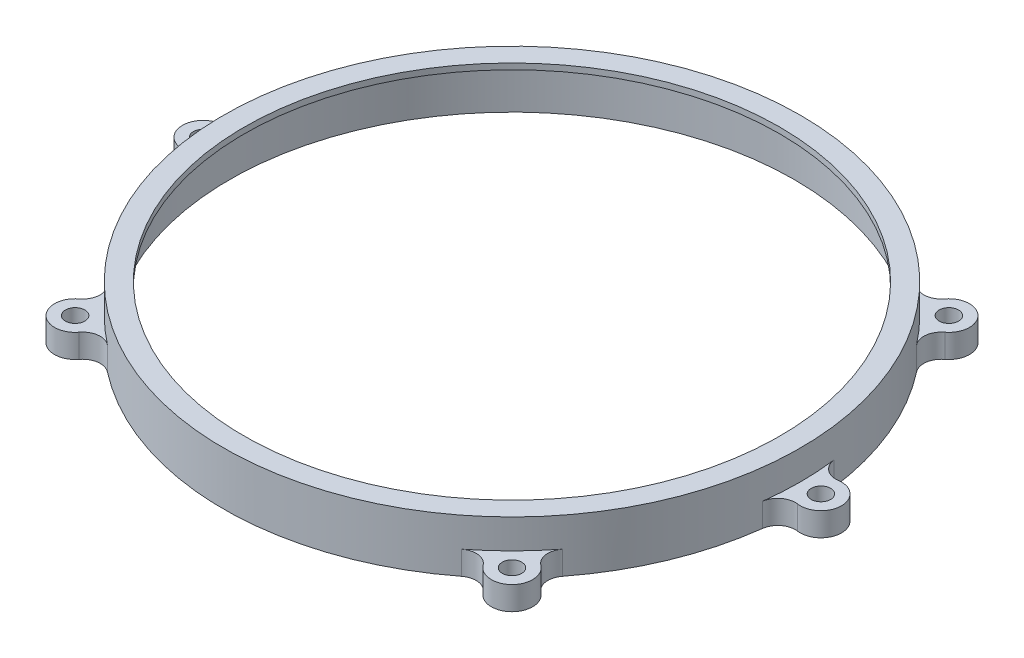
ISO-10303-21;
HEADER;
FILE_DESCRIPTION(('STEP AP214'),'2;1');
FILE_NAME('part.step','',(''),(''),'','','');
FILE_SCHEMA(('AUTOMOTIVE_DESIGN { 1 0 10303 214 1 1 1 1 }'));
ENDSEC;
DATA;
#1=APPLICATION_CONTEXT('core data for automotive mechanical design processes');
#2=APPLICATION_PROTOCOL_DEFINITION('international standard','automotive_design',2000,#1);
#3=PRODUCT_CONTEXT('',#1,'mechanical');
#4=PRODUCT('Part','Part','',(#3));
#5=PRODUCT_RELATED_PRODUCT_CATEGORY('part','',(#4));
#6=PRODUCT_DEFINITION_FORMATION('','',#4);
#7=PRODUCT_DEFINITION_CONTEXT('part definition',#1,'design');
#8=PRODUCT_DEFINITION('design','',#6,#7);
#9=PRODUCT_DEFINITION_SHAPE('','',#8);
#10=(LENGTH_UNIT() NAMED_UNIT(*) SI_UNIT(.MILLI.,.METRE.));
#11=(NAMED_UNIT(*) PLANE_ANGLE_UNIT() SI_UNIT($,.RADIAN.));
#12=(NAMED_UNIT(*) SI_UNIT($,.STERADIAN.) SOLID_ANGLE_UNIT());
#13=UNCERTAINTY_MEASURE_WITH_UNIT(LENGTH_MEASURE(1.E-05),#10,'distance_accuracy_value','');
#14=(GEOMETRIC_REPRESENTATION_CONTEXT(3) GLOBAL_UNCERTAINTY_ASSIGNED_CONTEXT((#13)) GLOBAL_UNIT_ASSIGNED_CONTEXT((#10,
#11,#12)) REPRESENTATION_CONTEXT('',''));
#15=CARTESIAN_POINT('',(0.,0.,0.));
#16=DIRECTION('',(0.,0.,1.));
#17=DIRECTION('',(1.,0.,0.));
#18=AXIS2_PLACEMENT_3D('',#15,#16,#17);
#19=CARTESIAN_POINT('',(56.,4.,0.));
#20=DIRECTION('',(0.,1.,0.));
#21=DIRECTION('',(0.,0.,1.));
#22=AXIS2_PLACEMENT_3D('',#19,#20,#21);
#23=PLANE('',#22);
#24=CARTESIAN_POINT('',(-31.9347872385294,4.,-41.0386325799223));
#25=DIRECTION('',(0.,1.,0.));
#26=DIRECTION('',(0.,0.,1.));
#27=AXIS2_PLACEMENT_3D('',#24,#25,#26);
#28=CIRCLE('',#27,3.);
#29=CARTESIAN_POINT('',(-34.3293959033437,4.,-39.231466471786));
#30=VERTEX_POINT('',#29);
#31=CARTESIAN_POINT('',(-30.0923956670758,4.,-38.6710191618498));
#32=VERTEX_POINT('',#31);
#33=EDGE_CURVE('E367',#30,#32,#28,.T.);
#34=ORIENTED_EDGE('',*,*,#33,.F.);
#35=CARTESIAN_POINT('',(-37.1231060122937,4.,-37.1231060122937));
#36=DIRECTION('',(0.,1.,0.));
#37=DIRECTION('',(0.,0.,1.));
#38=AXIS2_PLACEMENT_3D('',#35,#36,#37);
#39=CIRCLE('',#38,3.5);
#40=CARTESIAN_POINT('',(-39.231466471786,4.,-34.3293959033437));
#41=VERTEX_POINT('',#40);
#42=EDGE_CURVE('E217',#41,#30,#39,.F.);
#43=ORIENTED_EDGE('',*,*,#42,.F.);
#44=CARTESIAN_POINT('',(-41.0386325799223,4.,-31.9347872385294));
#45=DIRECTION('',(0.,1.,0.));
#46=DIRECTION('',(0.,0.,1.));
#47=AXIS2_PLACEMENT_3D('',#44,#45,#46);
#48=CIRCLE('',#47,3.00000000000001);
#49=CARTESIAN_POINT('',(-38.6710191618498,4.,-30.0923956670758));
#50=VERTEX_POINT('',#49);
#51=EDGE_CURVE('E364',#50,#41,#48,.T.);
#52=ORIENTED_EDGE('',*,*,#51,.F.);
#53=CARTESIAN_POINT('',(0.,4.,0.));
#54=DIRECTION('',(0.,-1.,0.));
#55=DIRECTION('',(0.,0.,-1.));
#56=AXIS2_PLACEMENT_3D('',#53,#54,#55);
#57=CIRCLE('',#56,49.);
#58=EDGE_CURVE('E408',#50,#32,#57,.T.);
#59=ORIENTED_EDGE('',*,*,#58,.T.);
#60=EDGE_LOOP('',(#34,#43,#52,#59));
#61=FACE_BOUND('',#60,.T.);
#62=CARTESIAN_POINT('',(-37.1231060122937,4.,-37.1231060122937));
#63=DIRECTION('',(0.,1.,0.));
#64=DIRECTION('',(0.,0.,1.));
#65=AXIS2_PLACEMENT_3D('',#62,#63,#64);
#66=CIRCLE('',#65,1.65);
#67=CARTESIAN_POINT('',(-37.1231060122937,4.,-35.4731060122938));
#68=VERTEX_POINT('',#67);
#69=EDGE_CURVE('E372',#68,#68,#66,.T.);
#70=ORIENTED_EDGE('',*,*,#69,.F.);
#71=EDGE_LOOP('',(#70));
#72=FACE_BOUND('',#71,.T.);
#73=ADVANCED_FACE('F37',(#61,#72),#23,.T.);
#74=CARTESIAN_POINT('',(-51.5999999999999,4.,-6.43739077577305));
#75=DIRECTION('',(0.,1.,0.));
#76=DIRECTION('',(0.,0.,1.));
#77=AXIS2_PLACEMENT_3D('',#74,#75,#76);
#78=CIRCLE('',#77,3.);
#79=CARTESIAN_POINT('',(-52.0153846153846,4.,-3.46628734080116));
#80=VERTEX_POINT('',#79);
#81=CARTESIAN_POINT('',(-48.6230769230769,4.,-6.06600284640157));
#82=VERTEX_POINT('',#81);
#83=EDGE_CURVE('E362',#80,#82,#78,.T.);
#84=ORIENTED_EDGE('',*,*,#83,.F.);
#85=CARTESIAN_POINT('',(-52.5,4.,-6.34908792207511E-13));
#86=DIRECTION('',(0.,1.,0.));
#87=DIRECTION('',(0.,0.,1.));
#88=AXIS2_PLACEMENT_3D('',#85,#86,#87);
#89=CIRCLE('',#88,3.5);
#90=CARTESIAN_POINT('',(-52.0153846153847,4.,3.46628734079991));
#91=VERTEX_POINT('',#90);
#92=EDGE_CURVE('E360',#91,#80,#89,.F.);
#93=ORIENTED_EDGE('',*,*,#92,.F.);
#94=CARTESIAN_POINT('',(-51.6000000000001,4.,6.43739077577181));
#95=DIRECTION('',(0.,1.,0.));
#96=DIRECTION('',(0.,0.,1.));
#97=AXIS2_PLACEMENT_3D('',#94,#95,#96);
#98=CIRCLE('',#97,3.00000000000001);
#99=CARTESIAN_POINT('',(-48.623076923077,4.,6.06600284640036));
#100=VERTEX_POINT('',#99);
#101=EDGE_CURVE('E358',#100,#91,#98,.T.);
#102=ORIENTED_EDGE('',*,*,#101,.F.);
#103=EDGE_CURVE('E633',#100,#82,#57,.T.);
#104=ORIENTED_EDGE('',*,*,#103,.T.);
#105=EDGE_LOOP('',(#84,#93,#102,#104));
#106=FACE_BOUND('',#105,.T.);
#107=CARTESIAN_POINT('',(-52.5,4.,9.17114576262564E-13));
#108=DIRECTION('',(0.,1.,0.));
#109=DIRECTION('',(0.,0.,1.));
#110=AXIS2_PLACEMENT_3D('',#107,#108,#109);
#111=CIRCLE('',#110,1.65);
#112=CARTESIAN_POINT('',(-52.5,4.,1.65000000000091));
#113=VERTEX_POINT('',#112);
#114=EDGE_CURVE('E378',#113,#113,#111,.T.);
#115=ORIENTED_EDGE('',*,*,#114,.F.);
#116=EDGE_LOOP('',(#115));
#117=FACE_BOUND('',#116,.T.);
#118=ADVANCED_FACE('F433',(#106,#117),#23,.T.);
#119=CARTESIAN_POINT('',(-41.0386325799226,4.,31.934787238529));
#120=DIRECTION('',(0.,1.,0.));
#121=DIRECTION('',(0.,0.,1.));
#122=AXIS2_PLACEMENT_3D('',#119,#120,#121);
#123=CIRCLE('',#122,3.);
#124=CARTESIAN_POINT('',(-39.2314664717864,4.,34.3293959033433));
#125=VERTEX_POINT('',#124);
#126=CARTESIAN_POINT('',(-38.6710191618501,4.,30.0923956670754));
#127=VERTEX_POINT('',#126);
#128=EDGE_CURVE('E356',#125,#127,#123,.T.);
#129=ORIENTED_EDGE('',*,*,#128,.F.);
#130=CARTESIAN_POINT('',(-37.1231060122941,4.,37.1231060122934));
#131=DIRECTION('',(0.,1.,0.));
#132=DIRECTION('',(0.,0.,1.));
#133=AXIS2_PLACEMENT_3D('',#130,#131,#132);
#134=CIRCLE('',#133,3.5);
#135=CARTESIAN_POINT('',(-34.3293959033441,4.,39.2314664717857));
#136=VERTEX_POINT('',#135);
#137=EDGE_CURVE('E354',#136,#125,#134,.F.);
#138=ORIENTED_EDGE('',*,*,#137,.F.);
#139=CARTESIAN_POINT('',(-31.9347872385299,4.,41.038632579922));
#140=DIRECTION('',(0.,1.,0.));
#141=DIRECTION('',(0.,0.,1.));
#142=AXIS2_PLACEMENT_3D('',#139,#140,#141);
#143=CIRCLE('',#142,3.);
#144=CARTESIAN_POINT('',(-30.0923956670762,4.,38.6710191618495));
#145=VERTEX_POINT('',#144);
#146=EDGE_CURVE('E352',#145,#136,#143,.T.);
#147=ORIENTED_EDGE('',*,*,#146,.F.);
#148=EDGE_CURVE('E612',#145,#127,#57,.T.);
#149=ORIENTED_EDGE('',*,*,#148,.T.);
#150=EDGE_LOOP('',(#129,#138,#147,#149));
#151=FACE_BOUND('',#150,.T.);
#152=CARTESIAN_POINT('',(-37.1231060122936,4.,37.123106012294));
#153=DIRECTION('',(0.,1.,0.));
#154=DIRECTION('',(0.,0.,1.));
#155=AXIS2_PLACEMENT_3D('',#152,#153,#154);
#156=CIRCLE('',#155,1.65);
#157=CARTESIAN_POINT('',(-37.1231060122936,4.,38.7731060122939));
#158=VERTEX_POINT('',#157);
#159=EDGE_CURVE('E384',#158,#158,#156,.T.);
#160=ORIENTED_EDGE('',*,*,#159,.F.);
#161=EDGE_LOOP('',(#160));
#162=FACE_BOUND('',#161,.T.);
#163=ADVANCED_FACE('F440',(#151,#162),#23,.T.);
#164=CARTESIAN_POINT('',(31.9347872385292,4.,41.0386325799225));
#165=DIRECTION('',(0.,1.,0.));
#166=DIRECTION('',(0.,0.,1.));
#167=AXIS2_PLACEMENT_3D('',#164,#165,#166);
#168=CIRCLE('',#167,3.);
#169=CARTESIAN_POINT('',(34.3293959033435,4.,39.2314664717863));
#170=VERTEX_POINT('',#169);
#171=CARTESIAN_POINT('',(30.0923956670756,4.,38.67101916185));
#172=VERTEX_POINT('',#171);
#173=EDGE_CURVE('E350',#170,#172,#168,.T.);
#174=ORIENTED_EDGE('',*,*,#173,.F.);
#175=CARTESIAN_POINT('',(37.1231060122935,4.,37.123106012294));
#176=DIRECTION('',(0.,1.,0.));
#177=DIRECTION('',(0.,0.,1.));
#178=AXIS2_PLACEMENT_3D('',#175,#176,#177);
#179=CIRCLE('',#178,3.5);
#180=CARTESIAN_POINT('',(39.2314664717858,4.,34.329395903344));
#181=VERTEX_POINT('',#180);
#182=EDGE_CURVE('E348',#181,#170,#179,.F.);
#183=ORIENTED_EDGE('',*,*,#182,.F.);
#184=CARTESIAN_POINT('',(41.0386325799221,4.,31.9347872385297));
#185=DIRECTION('',(0.,1.,0.));
#186=DIRECTION('',(0.,0.,1.));
#187=AXIS2_PLACEMENT_3D('',#184,#185,#186);
#188=CIRCLE('',#187,3.);
#189=CARTESIAN_POINT('',(38.6710191618496,4.,30.0923956670761));
#190=VERTEX_POINT('',#189);
#191=EDGE_CURVE('E346',#190,#181,#188,.T.);
#192=ORIENTED_EDGE('',*,*,#191,.F.);
#193=EDGE_CURVE('E600',#190,#172,#57,.T.);
#194=ORIENTED_EDGE('',*,*,#193,.T.);
#195=EDGE_LOOP('',(#174,#183,#192,#194));
#196=FACE_BOUND('',#195,.T.);
#197=CARTESIAN_POINT('',(37.1231060122941,4.,37.1231060122934));
#198=DIRECTION('',(0.,1.,0.));
#199=DIRECTION('',(0.,0.,1.));
#200=AXIS2_PLACEMENT_3D('',#197,#198,#199);
#201=CIRCLE('',#200,1.65);
#202=CARTESIAN_POINT('',(37.1231060122941,4.,38.7731060122934));
#203=VERTEX_POINT('',#202);
#204=EDGE_CURVE('E390',#203,#203,#201,.T.);
#205=ORIENTED_EDGE('',*,*,#204,.F.);
#206=EDGE_LOOP('',(#205));
#207=FACE_BOUND('',#206,.T.);
#208=ADVANCED_FACE('F459',(#196,#207),#23,.T.);
#209=CARTESIAN_POINT('',(51.6,4.,6.43739077577269));
#210=DIRECTION('',(0.,1.,0.));
#211=DIRECTION('',(0.,0.,1.));
#212=AXIS2_PLACEMENT_3D('',#209,#210,#211);
#213=CIRCLE('',#212,3.);
#214=CARTESIAN_POINT('',(52.0153846153846,4.,3.4662873408008));
#215=VERTEX_POINT('',#214);
#216=CARTESIAN_POINT('',(48.6230769230769,4.,6.06600284640121));
#217=VERTEX_POINT('',#216);
#218=EDGE_CURVE('E344',#215,#217,#213,.T.);
#219=ORIENTED_EDGE('',*,*,#218,.F.);
#220=CARTESIAN_POINT('',(52.5,4.,2.74086309204336E-13));
#221=DIRECTION('',(0.,1.,0.));
#222=DIRECTION('',(0.,0.,1.));
#223=AXIS2_PLACEMENT_3D('',#220,#221,#222);
#224=CIRCLE('',#223,3.5);
#225=CARTESIAN_POINT('',(52.0153846153847,4.,-3.46628734080027));
#226=VERTEX_POINT('',#225);
#227=EDGE_CURVE('E342',#226,#215,#224,.F.);
#228=ORIENTED_EDGE('',*,*,#227,.F.);
#229=CARTESIAN_POINT('',(51.6000000000001,4.,-6.43739077577217));
#230=DIRECTION('',(0.,1.,0.));
#231=DIRECTION('',(0.,0.,1.));
#232=AXIS2_PLACEMENT_3D('',#229,#230,#231);
#233=CIRCLE('',#232,3.00000000000001);
#234=CARTESIAN_POINT('',(48.623076923077,4.,-6.06600284640069));
#235=VERTEX_POINT('',#234);
#236=EDGE_CURVE('E340',#235,#226,#233,.T.);
#237=ORIENTED_EDGE('',*,*,#236,.F.);
#238=EDGE_CURVE('E413',#235,#217,#57,.T.);
#239=ORIENTED_EDGE('',*,*,#238,.T.);
#240=EDGE_LOOP('',(#219,#228,#237,#239));
#241=FACE_BOUND('',#240,.T.);
#242=CARTESIAN_POINT('',(52.5,4.,-5.45281089620994E-13));
#243=DIRECTION('',(0.,1.,0.));
#244=DIRECTION('',(0.,0.,1.));
#245=AXIS2_PLACEMENT_3D('',#242,#243,#244);
#246=CIRCLE('',#245,1.65);
#247=CARTESIAN_POINT('',(52.5,4.,1.64999999999945));
#248=VERTEX_POINT('',#247);
#249=EDGE_CURVE('E396',#248,#248,#246,.T.);
#250=ORIENTED_EDGE('',*,*,#249,.F.);
#251=EDGE_LOOP('',(#250));
#252=FACE_BOUND('',#251,.T.);
#253=ADVANCED_FACE('F448',(#241,#252),#23,.T.);
#254=CARTESIAN_POINT('',(48.,0.,0.));
#255=DIRECTION('',(0.,-1.,0.));
#256=DIRECTION('',(0.,0.,-1.));
#257=AXIS2_PLACEMENT_3D('',#254,#255,#256);
#258=PLANE('',#257);
#259=CARTESIAN_POINT('',(-37.1231060122937,0.,-37.1231060122937));
#260=DIRECTION('',(0.,-1.,0.));
#261=DIRECTION('',(0.,0.,-1.));
#262=AXIS2_PLACEMENT_3D('',#259,#260,#261);
#263=CIRCLE('',#262,1.64999999999999);
#264=CARTESIAN_POINT('',(-37.1231060122937,0.,-38.7731060122937));
#265=VERTEX_POINT('',#264);
#266=EDGE_CURVE('E369',#265,#265,#263,.T.);
#267=ORIENTED_EDGE('',*,*,#266,.F.);
#268=EDGE_LOOP('',(#267));
#269=FACE_BOUND('',#268,.T.);
#270=CARTESIAN_POINT('',(-52.5,0.,9.17114576262564E-13));
#271=DIRECTION('',(0.,-1.,0.));
#272=DIRECTION('',(0.,0.,-1.));
#273=AXIS2_PLACEMENT_3D('',#270,#271,#272);
#274=CIRCLE('',#273,1.64999999999999);
#275=CARTESIAN_POINT('',(-52.5,0.,-1.64999999999907));
#276=VERTEX_POINT('',#275);
#277=EDGE_CURVE('E375',#276,#276,#274,.T.);
#278=ORIENTED_EDGE('',*,*,#277,.F.);
#279=EDGE_LOOP('',(#278));
#280=FACE_BOUND('',#279,.T.);
#281=CARTESIAN_POINT('',(-37.1231060122936,0.,37.123106012294));
#282=DIRECTION('',(0.,-1.,0.));
#283=DIRECTION('',(0.,0.,-1.));
#284=AXIS2_PLACEMENT_3D('',#281,#282,#283);
#285=CIRCLE('',#284,1.64999999999999);
#286=CARTESIAN_POINT('',(-37.1231060122936,0.,35.473106012294));
#287=VERTEX_POINT('',#286);
#288=EDGE_CURVE('E381',#287,#287,#285,.T.);
#289=ORIENTED_EDGE('',*,*,#288,.F.);
#290=EDGE_LOOP('',(#289));
#291=FACE_BOUND('',#290,.T.);
#292=CARTESIAN_POINT('',(37.1231060122941,0.,37.1231060122934));
#293=DIRECTION('',(0.,-1.,0.));
#294=DIRECTION('',(0.,0.,-1.));
#295=AXIS2_PLACEMENT_3D('',#292,#293,#294);
#296=CIRCLE('',#295,1.64999999999999);
#297=CARTESIAN_POINT('',(37.1231060122941,0.,35.4731060122934));
#298=VERTEX_POINT('',#297);
#299=EDGE_CURVE('E387',#298,#298,#296,.T.);
#300=ORIENTED_EDGE('',*,*,#299,.F.);
#301=EDGE_LOOP('',(#300));
#302=FACE_BOUND('',#301,.T.);
#303=CARTESIAN_POINT('',(52.5,0.,-5.45281089620994E-13));
#304=DIRECTION('',(0.,-1.,0.));
#305=DIRECTION('',(0.,0.,-1.));
#306=AXIS2_PLACEMENT_3D('',#303,#304,#305);
#307=CIRCLE('',#306,1.64999999999999);
#308=CARTESIAN_POINT('',(52.5,0.,-1.65000000000054));
#309=VERTEX_POINT('',#308);
#310=EDGE_CURVE('E393',#309,#309,#307,.T.);
#311=ORIENTED_EDGE('',*,*,#310,.F.);
#312=EDGE_LOOP('',(#311));
#313=FACE_BOUND('',#312,.T.);
#314=CARTESIAN_POINT('',(37.1231060122937,0.,-37.1231060122937));
#315=DIRECTION('',(0.,-1.,0.));
#316=DIRECTION('',(0.,0.,-1.));
#317=AXIS2_PLACEMENT_3D('',#314,#315,#316);
#318=CIRCLE('',#317,1.64999999999999);
#319=CARTESIAN_POINT('',(37.1231060122937,0.,-38.7731060122937));
#320=VERTEX_POINT('',#319);
#321=EDGE_CURVE('E399',#320,#320,#318,.T.);
#322=ORIENTED_EDGE('',*,*,#321,.F.);
#323=EDGE_LOOP('',(#322));
#324=FACE_BOUND('',#323,.T.);
#325=CARTESIAN_POINT('',(0.,0.,0.));
#326=DIRECTION('',(0.,-1.,0.));
#327=DIRECTION('',(0.,0.,-1.));
#328=AXIS2_PLACEMENT_3D('',#325,#326,#327);
#329=CIRCLE('',#328,48.);
#330=CARTESIAN_POINT('',(0.,0.,-48.));
#331=VERTEX_POINT('',#330);
#332=EDGE_CURVE('E405',#331,#331,#329,.T.);
#333=ORIENTED_EDGE('',*,*,#332,.F.);
#334=EDGE_LOOP('',(#333));
#335=FACE_BOUND('',#334,.T.);
#336=CARTESIAN_POINT('',(-31.9347872385294,0.,-41.0386325799223));
#337=DIRECTION('',(0.,-1.,0.));
#338=DIRECTION('',(0.,0.,-1.));
#339=AXIS2_PLACEMENT_3D('',#336,#337,#338);
#340=CIRCLE('',#339,3.);
#341=CARTESIAN_POINT('',(-30.0923956670758,0.,-38.6710191618498));
#342=VERTEX_POINT('',#341);
#343=CARTESIAN_POINT('',(-34.3293959033437,0.,-39.231466471786));
#344=VERTEX_POINT('',#343);
#345=EDGE_CURVE('E206',#342,#344,#340,.T.);
#346=ORIENTED_EDGE('',*,*,#345,.F.);
#347=CARTESIAN_POINT('',(0.,0.,0.));
#348=DIRECTION('',(0.,1.,0.));
#349=DIRECTION('',(0.,0.,-1.));
#350=AXIS2_PLACEMENT_3D('',#347,#348,#349);
#351=CIRCLE('',#350,49.);
#352=CARTESIAN_POINT('',(30.0923956670765,0.,-38.6710191618493));
#353=VERTEX_POINT('',#352);
#354=EDGE_CURVE('E283',#353,#342,#351,.T.);
#355=ORIENTED_EDGE('',*,*,#354,.F.);
#356=CARTESIAN_POINT('',(31.9347872385302,0.,-41.0386325799217));
#357=DIRECTION('',(0.,-1.,0.));
#358=DIRECTION('',(0.,0.,1.));
#359=AXIS2_PLACEMENT_3D('',#356,#357,#358);
#360=CIRCLE('',#359,3.00000000000001);
#361=CARTESIAN_POINT('',(34.3293959033444,0.,-39.2314664717854));
#362=VERTEX_POINT('',#361);
#363=EDGE_CURVE('E61',#362,#353,#360,.T.);
#364=ORIENTED_EDGE('',*,*,#363,.F.);
#365=CARTESIAN_POINT('',(37.1231060122944,0.,-37.1231060122931));
#366=DIRECTION('',(0.,1.,0.));
#367=DIRECTION('',(0.,0.,1.));
#368=AXIS2_PLACEMENT_3D('',#365,#366,#367);
#369=CIRCLE('',#368,3.5);
#370=CARTESIAN_POINT('',(39.2314664717866,0.,-34.3293959033431));
#371=VERTEX_POINT('',#370);
#372=EDGE_CURVE('E279',#371,#362,#369,.T.);
#373=ORIENTED_EDGE('',*,*,#372,.F.);
#374=CARTESIAN_POINT('',(41.0386325799228,0.,-31.9347872385287));
#375=DIRECTION('',(0.,-1.,0.));
#376=DIRECTION('',(0.,0.,-1.));
#377=AXIS2_PLACEMENT_3D('',#374,#375,#376);
#378=CIRCLE('',#377,3.);
#379=CARTESIAN_POINT('',(38.6710191618504,0.,-30.0923956670752));
#380=VERTEX_POINT('',#379);
#381=EDGE_CURVE('E276',#380,#371,#378,.T.);
#382=ORIENTED_EDGE('',*,*,#381,.F.);
#383=CARTESIAN_POINT('',(0.,0.,0.));
#384=DIRECTION('',(0.,1.,0.));
#385=DIRECTION('',(0.,0.,1.));
#386=AXIS2_PLACEMENT_3D('',#383,#384,#385);
#387=CIRCLE('',#386,49.);
#388=CARTESIAN_POINT('',(48.623076923077,0.,-6.06600284640069));
#389=VERTEX_POINT('',#388);
#390=EDGE_CURVE('E273',#389,#380,#387,.T.);
#391=ORIENTED_EDGE('',*,*,#390,.F.);
#392=CARTESIAN_POINT('',(51.6000000000001,0.,-6.43739077577217));
#393=DIRECTION('',(0.,-1.,0.));
#394=DIRECTION('',(0.,0.,1.));
#395=AXIS2_PLACEMENT_3D('',#392,#393,#394);
#396=CIRCLE('',#395,3.00000000000001);
#397=CARTESIAN_POINT('',(52.0153846153847,0.,-3.46628734080027));
#398=VERTEX_POINT('',#397);
#399=EDGE_CURVE('E270',#398,#389,#396,.T.);
#400=ORIENTED_EDGE('',*,*,#399,.F.);
#401=CARTESIAN_POINT('',(52.5,0.,2.74086309204336E-13));
#402=DIRECTION('',(0.,1.,0.));
#403=DIRECTION('',(0.,0.,1.));
#404=AXIS2_PLACEMENT_3D('',#401,#402,#403);
#405=CIRCLE('',#404,3.5);
#406=CARTESIAN_POINT('',(52.0153846153846,0.,3.4662873408008));
#407=VERTEX_POINT('',#406);
#408=EDGE_CURVE('E267',#407,#398,#405,.T.);
#409=ORIENTED_EDGE('',*,*,#408,.F.);
#410=CARTESIAN_POINT('',(51.6,0.,6.43739077577269));
#411=DIRECTION('',(0.,-1.,0.));
#412=DIRECTION('',(0.,0.,-1.));
#413=AXIS2_PLACEMENT_3D('',#410,#411,#412);
#414=CIRCLE('',#413,3.);
#415=CARTESIAN_POINT('',(48.6230769230769,0.,6.06600284640121));
#416=VERTEX_POINT('',#415);
#417=EDGE_CURVE('E264',#416,#407,#414,.T.);
#418=ORIENTED_EDGE('',*,*,#417,.F.);
#419=CARTESIAN_POINT('',(0.,0.,0.));
#420=DIRECTION('',(0.,1.,0.));
#421=DIRECTION('',(0.,0.,1.));
#422=AXIS2_PLACEMENT_3D('',#419,#420,#421);
#423=CIRCLE('',#422,49.);
#424=CARTESIAN_POINT('',(38.6710191618496,0.,30.0923956670761));
#425=VERTEX_POINT('',#424);
#426=EDGE_CURVE('E261',#425,#416,#423,.T.);
#427=ORIENTED_EDGE('',*,*,#426,.F.);
#428=CARTESIAN_POINT('',(41.0386325799221,0.,31.9347872385297));
#429=DIRECTION('',(0.,-1.,0.));
#430=DIRECTION('',(0.,0.,1.));
#431=AXIS2_PLACEMENT_3D('',#428,#429,#430);
#432=CIRCLE('',#431,3.);
#433=CARTESIAN_POINT('',(39.2314664717858,0.,34.329395903344));
#434=VERTEX_POINT('',#433);
#435=EDGE_CURVE('E258',#434,#425,#432,.T.);
#436=ORIENTED_EDGE('',*,*,#435,.F.);
#437=CARTESIAN_POINT('',(37.1231060122935,0.,37.123106012294));
#438=DIRECTION('',(0.,1.,0.));
#439=DIRECTION('',(0.,0.,1.));
#440=AXIS2_PLACEMENT_3D('',#437,#438,#439);
#441=CIRCLE('',#440,3.5);
#442=CARTESIAN_POINT('',(34.3293959033435,0.,39.2314664717863));
#443=VERTEX_POINT('',#442);
#444=EDGE_CURVE('E255',#443,#434,#441,.T.);
#445=ORIENTED_EDGE('',*,*,#444,.F.);
#446=CARTESIAN_POINT('',(31.9347872385292,0.,41.0386325799225));
#447=DIRECTION('',(0.,-1.,0.));
#448=DIRECTION('',(0.,0.,-1.));
#449=AXIS2_PLACEMENT_3D('',#446,#447,#448);
#450=CIRCLE('',#449,3.);
#451=CARTESIAN_POINT('',(30.0923956670756,0.,38.67101916185));
#452=VERTEX_POINT('',#451);
#453=EDGE_CURVE('E252',#452,#443,#450,.T.);
#454=ORIENTED_EDGE('',*,*,#453,.F.);
#455=CARTESIAN_POINT('',(0.,0.,0.));
#456=DIRECTION('',(0.,1.,0.));
#457=DIRECTION('',(0.,0.,1.));
#458=AXIS2_PLACEMENT_3D('',#455,#456,#457);
#459=CIRCLE('',#458,49.);
#460=CARTESIAN_POINT('',(-30.0923956670762,0.,38.6710191618495));
#461=VERTEX_POINT('',#460);
#462=EDGE_CURVE('E249',#461,#452,#459,.T.);
#463=ORIENTED_EDGE('',*,*,#462,.F.);
#464=CARTESIAN_POINT('',(-31.9347872385299,0.,41.038632579922));
#465=DIRECTION('',(0.,-1.,0.));
#466=DIRECTION('',(0.,0.,1.));
#467=AXIS2_PLACEMENT_3D('',#464,#465,#466);
#468=CIRCLE('',#467,3.);
#469=CARTESIAN_POINT('',(-34.3293959033441,0.,39.2314664717857));
#470=VERTEX_POINT('',#469);
#471=EDGE_CURVE('E246',#470,#461,#468,.T.);
#472=ORIENTED_EDGE('',*,*,#471,.F.);
#473=CARTESIAN_POINT('',(-37.1231060122941,0.,37.1231060122934));
#474=DIRECTION('',(0.,1.,0.));
#475=DIRECTION('',(0.,0.,1.));
#476=AXIS2_PLACEMENT_3D('',#473,#474,#475);
#477=CIRCLE('',#476,3.5);
#478=CARTESIAN_POINT('',(-39.2314664717864,0.,34.3293959033433));
#479=VERTEX_POINT('',#478);
#480=EDGE_CURVE('E244',#479,#470,#477,.T.);
#481=ORIENTED_EDGE('',*,*,#480,.F.);
#482=CARTESIAN_POINT('',(-41.0386325799226,0.,31.934787238529));
#483=DIRECTION('',(0.,-1.,0.));
#484=DIRECTION('',(0.,0.,-1.));
#485=AXIS2_PLACEMENT_3D('',#482,#483,#484);
#486=CIRCLE('',#485,3.);
#487=CARTESIAN_POINT('',(-38.6710191618501,0.,30.0923956670754));
#488=VERTEX_POINT('',#487);
#489=EDGE_CURVE('E241',#488,#479,#486,.T.);
#490=ORIENTED_EDGE('',*,*,#489,.F.);
#491=CARTESIAN_POINT('',(0.,0.,0.));
#492=DIRECTION('',(0.,1.,0.));
#493=DIRECTION('',(0.,0.,1.));
#494=AXIS2_PLACEMENT_3D('',#491,#492,#493);
#495=CIRCLE('',#494,49.);
#496=CARTESIAN_POINT('',(-48.623076923077,0.,6.06600284640036));
#497=VERTEX_POINT('',#496);
#498=EDGE_CURVE('E238',#497,#488,#495,.T.);
#499=ORIENTED_EDGE('',*,*,#498,.F.);
#500=CARTESIAN_POINT('',(-51.6000000000001,0.,6.43739077577181));
#501=DIRECTION('',(0.,-1.,0.));
#502=DIRECTION('',(0.,0.,1.));
#503=AXIS2_PLACEMENT_3D('',#500,#501,#502);
#504=CIRCLE('',#503,3.00000000000001);
#505=CARTESIAN_POINT('',(-52.0153846153847,0.,3.46628734079991));
#506=VERTEX_POINT('',#505);
#507=EDGE_CURVE('E235',#506,#497,#504,.T.);
#508=ORIENTED_EDGE('',*,*,#507,.F.);
#509=CARTESIAN_POINT('',(-52.5,0.,-6.34908792207511E-13));
#510=DIRECTION('',(0.,1.,0.));
#511=DIRECTION('',(0.,0.,1.));
#512=AXIS2_PLACEMENT_3D('',#509,#510,#511);
#513=CIRCLE('',#512,3.5);
#514=CARTESIAN_POINT('',(-52.0153846153846,0.,-3.46628734080116));
#515=VERTEX_POINT('',#514);
#516=EDGE_CURVE('E232',#515,#506,#513,.T.);
#517=ORIENTED_EDGE('',*,*,#516,.F.);
#518=CARTESIAN_POINT('',(-51.5999999999999,0.,-6.43739077577305));
#519=DIRECTION('',(0.,-1.,0.));
#520=DIRECTION('',(0.,0.,-1.));
#521=AXIS2_PLACEMENT_3D('',#518,#519,#520);
#522=CIRCLE('',#521,3.);
#523=CARTESIAN_POINT('',(-48.6230769230769,0.,-6.06600284640157));
#524=VERTEX_POINT('',#523);
#525=EDGE_CURVE('E229',#524,#515,#522,.T.);
#526=ORIENTED_EDGE('',*,*,#525,.F.);
#527=CARTESIAN_POINT('',(0.,0.,0.));
#528=DIRECTION('',(0.,1.,0.));
#529=DIRECTION('',(0.,0.,1.));
#530=AXIS2_PLACEMENT_3D('',#527,#528,#529);
#531=CIRCLE('',#530,49.);
#532=CARTESIAN_POINT('',(-38.6710191618498,0.,-30.0923956670758));
#533=VERTEX_POINT('',#532);
#534=EDGE_CURVE('E226',#533,#524,#531,.T.);
#535=ORIENTED_EDGE('',*,*,#534,.F.);
#536=CARTESIAN_POINT('',(-41.0386325799223,0.,-31.9347872385294));
#537=DIRECTION('',(0.,-1.,0.));
#538=DIRECTION('',(0.,0.,1.));
#539=AXIS2_PLACEMENT_3D('',#536,#537,#538);
#540=CIRCLE('',#539,3.00000000000001);
#541=CARTESIAN_POINT('',(-39.231466471786,0.,-34.3293959033437));
#542=VERTEX_POINT('',#541);
#543=EDGE_CURVE('E209',#542,#533,#540,.T.);
#544=ORIENTED_EDGE('',*,*,#543,.F.);
#545=CARTESIAN_POINT('',(-37.1231060122937,0.,-37.1231060122937));
#546=DIRECTION('',(0.,1.,0.));
#547=DIRECTION('',(0.,0.,1.));
#548=AXIS2_PLACEMENT_3D('',#545,#546,#547);
#549=CIRCLE('',#548,3.5);
#550=EDGE_CURVE('E201',#344,#542,#549,.T.);
#551=ORIENTED_EDGE('',*,*,#550,.F.);
#552=EDGE_LOOP('',(#346,#355,#364,#373,#382,#391,#400,#409,#418,#427,#436,#445,#454,#463,#472,
#481,#490,#499,#508,#517,#526,#535,#544,#551));
#553=FACE_BOUND('',#552,.T.);
#554=ADVANCED_FACE('F203',(#269,#280,#291,#302,#313,#324,#335,#553),#258,.T.);
#555=CARTESIAN_POINT('',(45.5,8.,0.));
#556=DIRECTION('',(0.,-1.,0.));
#557=DIRECTION('',(0.,0.,-1.));
#558=AXIS2_PLACEMENT_3D('',#555,#556,#557);
#559=PLANE('',#558);
#560=CARTESIAN_POINT('',(0.,8.,0.));
#561=DIRECTION('',(0.,-1.,0.));
#562=DIRECTION('',(0.,0.,-1.));
#563=AXIS2_PLACEMENT_3D('',#560,#561,#562);
#564=CIRCLE('',#563,48.);
#565=CARTESIAN_POINT('',(0.,8.,-48.));
#566=VERTEX_POINT('',#565);
#567=EDGE_CURVE('E402',#566,#566,#564,.T.);
#568=ORIENTED_EDGE('',*,*,#567,.T.);
#569=EDGE_LOOP('',(#568));
#570=FACE_BOUND('',#569,.T.);
#571=CARTESIAN_POINT('',(0.,8.,0.));
#572=DIRECTION('',(0.,-1.,0.));
#573=DIRECTION('',(0.,0.,-1.));
#574=AXIS2_PLACEMENT_3D('',#571,#572,#573);
#575=CIRCLE('',#574,45.5);
#576=CARTESIAN_POINT('',(0.,8.,-45.5));
#577=VERTEX_POINT('',#576);
#578=EDGE_CURVE('E12',#577,#577,#575,.T.);
#579=ORIENTED_EDGE('',*,*,#578,.F.);
#580=EDGE_LOOP('',(#579));
#581=FACE_BOUND('',#580,.T.);
#582=ADVANCED_FACE('F39',(#570,#581),#559,.T.);
#583=CARTESIAN_POINT('',(0.,0.,0.));
#584=DIRECTION('',(0.,-1.,0.));
#585=DIRECTION('',(0.,0.,-1.));
#586=AXIS2_PLACEMENT_3D('',#583,#584,#585);
#587=CYLINDRICAL_SURFACE('',#586,45.5);
#588=ORIENTED_EDGE('',*,*,#578,.T.);
#589=EDGE_LOOP('',(#588));
#590=FACE_BOUND('',#589,.T.);
#591=CARTESIAN_POINT('',(0.,9.,0.));
#592=DIRECTION('',(0.,-1.,0.));
#593=DIRECTION('',(0.,0.,-1.));
#594=AXIS2_PLACEMENT_3D('',#591,#592,#593);
#595=CIRCLE('',#594,45.5);
#596=CARTESIAN_POINT('',(0.,9.,-45.5));
#597=VERTEX_POINT('',#596);
#598=EDGE_CURVE('E46',#597,#597,#595,.T.);
#599=ORIENTED_EDGE('',*,*,#598,.F.);
#600=EDGE_LOOP('',(#599));
#601=FACE_BOUND('',#600,.T.);
#602=ADVANCED_FACE('F422',(#590,#601),#587,.F.);
#603=CARTESIAN_POINT('',(49.,9.,0.));
#604=DIRECTION('',(0.,1.,0.));
#605=DIRECTION('',(0.,0.,1.));
#606=AXIS2_PLACEMENT_3D('',#603,#604,#605);
#607=PLANE('',#606);
#608=ORIENTED_EDGE('',*,*,#598,.T.);
#609=EDGE_LOOP('',(#608));
#610=FACE_BOUND('',#609,.T.);
#611=CARTESIAN_POINT('',(0.,9.,0.));
#612=DIRECTION('',(0.,-1.,0.));
#613=DIRECTION('',(0.,0.,-1.));
#614=AXIS2_PLACEMENT_3D('',#611,#612,#613);
#615=CIRCLE('',#614,49.);
#616=CARTESIAN_POINT('',(0.,9.,-49.));
#617=VERTEX_POINT('',#616);
#618=EDGE_CURVE('E412',#617,#617,#615,.T.);
#619=ORIENTED_EDGE('',*,*,#618,.F.);
#620=EDGE_LOOP('',(#619));
#621=FACE_BOUND('',#620,.T.);
#622=ADVANCED_FACE('F419',(#610,#621),#607,.T.);
#623=CARTESIAN_POINT('',(0.,0.,0.));
#624=DIRECTION('',(0.,-1.,0.));
#625=DIRECTION('',(0.,0.,-1.));
#626=AXIS2_PLACEMENT_3D('',#623,#624,#625);
#627=CYLINDRICAL_SURFACE('',#626,49.);
#628=DIRECTION('',(0.,-1.,0.));
#629=VECTOR('',#628,1.);
#630=CARTESIAN_POINT('',(-30.0923956670758,9.,-38.6710191618498));
#631=LINE('',#630,#629);
#632=EDGE_CURVE('E53',#32,#342,#631,.T.);
#633=ORIENTED_EDGE('',*,*,#632,.F.);
#634=ORIENTED_EDGE('',*,*,#58,.F.);
#635=DIRECTION('',(0.,-1.,0.));
#636=VECTOR('',#635,1.);
#637=CARTESIAN_POINT('',(-38.6710191618498,9.,-30.0923956670758));
#638=LINE('',#637,#636);
#639=EDGE_CURVE('E330',#50,#533,#638,.T.);
#640=ORIENTED_EDGE('',*,*,#639,.T.);
#641=ORIENTED_EDGE('',*,*,#534,.T.);
#642=DIRECTION('',(0.,-1.,0.));
#643=VECTOR('',#642,1.);
#644=CARTESIAN_POINT('',(-48.6230769230769,9.,-6.06600284640157));
#645=LINE('',#644,#643);
#646=EDGE_CURVE('E328',#82,#524,#645,.T.);
#647=ORIENTED_EDGE('',*,*,#646,.F.);
#648=ORIENTED_EDGE('',*,*,#103,.F.);
#649=DIRECTION('',(0.,-1.,0.));
#650=VECTOR('',#649,1.);
#651=CARTESIAN_POINT('',(-48.623076923077,9.,6.06600284640036));
#652=LINE('',#651,#650);
#653=EDGE_CURVE('E321',#100,#497,#652,.T.);
#654=ORIENTED_EDGE('',*,*,#653,.T.);
#655=ORIENTED_EDGE('',*,*,#498,.T.);
#656=DIRECTION('',(0.,-1.,0.));
#657=VECTOR('',#656,1.);
#658=CARTESIAN_POINT('',(-38.6710191618501,9.,30.0923956670754));
#659=LINE('',#658,#657);
#660=EDGE_CURVE('E319',#127,#488,#659,.T.);
#661=ORIENTED_EDGE('',*,*,#660,.F.);
#662=ORIENTED_EDGE('',*,*,#148,.F.);
#663=DIRECTION('',(0.,-1.,0.));
#664=VECTOR('',#663,1.);
#665=CARTESIAN_POINT('',(-30.0923956670762,9.,38.6710191618495));
#666=LINE('',#665,#664);
#667=EDGE_CURVE('E312',#145,#461,#666,.T.);
#668=ORIENTED_EDGE('',*,*,#667,.T.);
#669=ORIENTED_EDGE('',*,*,#462,.T.);
#670=DIRECTION('',(0.,-1.,0.));
#671=VECTOR('',#670,1.);
#672=CARTESIAN_POINT('',(30.0923956670756,9.,38.67101916185));
#673=LINE('',#672,#671);
#674=EDGE_CURVE('E310',#172,#452,#673,.T.);
#675=ORIENTED_EDGE('',*,*,#674,.F.);
#676=ORIENTED_EDGE('',*,*,#193,.F.);
#677=DIRECTION('',(0.,-1.,0.));
#678=VECTOR('',#677,1.);
#679=CARTESIAN_POINT('',(38.6710191618496,9.,30.0923956670761));
#680=LINE('',#679,#678);
#681=EDGE_CURVE('E303',#190,#425,#680,.T.);
#682=ORIENTED_EDGE('',*,*,#681,.T.);
#683=ORIENTED_EDGE('',*,*,#426,.T.);
#684=DIRECTION('',(0.,-1.,0.));
#685=VECTOR('',#684,1.);
#686=CARTESIAN_POINT('',(48.6230769230769,9.,6.06600284640121));
#687=LINE('',#686,#685);
#688=EDGE_CURVE('E301',#217,#416,#687,.T.);
#689=ORIENTED_EDGE('',*,*,#688,.F.);
#690=ORIENTED_EDGE('',*,*,#238,.F.);
#691=DIRECTION('',(0.,-1.,0.));
#692=VECTOR('',#691,1.);
#693=CARTESIAN_POINT('',(48.623076923077,9.,-6.06600284640069));
#694=LINE('',#693,#692);
#695=EDGE_CURVE('E294',#235,#389,#694,.T.);
#696=ORIENTED_EDGE('',*,*,#695,.T.);
#697=ORIENTED_EDGE('',*,*,#390,.T.);
#698=DIRECTION('',(0.,-1.,0.));
#699=VECTOR('',#698,1.);
#700=CARTESIAN_POINT('',(38.6710191618504,9.,-30.0923956670752));
#701=LINE('',#700,#699);
#702=CARTESIAN_POINT('',(38.6710191618504,4.,-30.0923956670752));
#703=VERTEX_POINT('',#702);
#704=EDGE_CURVE('E292',#703,#380,#701,.T.);
#705=ORIENTED_EDGE('',*,*,#704,.F.);
#706=CARTESIAN_POINT('',(30.0923956670765,4.,-38.6710191618493));
#707=VERTEX_POINT('',#706);
#708=EDGE_CURVE('E409',#707,#703,#57,.T.);
#709=ORIENTED_EDGE('',*,*,#708,.F.);
#710=DIRECTION('',(0.,-1.,0.));
#711=VECTOR('',#710,1.);
#712=CARTESIAN_POINT('',(30.0923956670765,9.,-38.6710191618493));
#713=LINE('',#712,#711);
#714=EDGE_CURVE('E285',#707,#353,#713,.T.);
#715=ORIENTED_EDGE('',*,*,#714,.T.);
#716=ORIENTED_EDGE('',*,*,#354,.T.);
#717=EDGE_LOOP('',(#633,#634,#640,#641,#647,#648,#654,#655,#661,#662,#668,#669,#675,#676,#682,
#683,#689,#690,#696,#697,#705,#709,#715,#716));
#718=FACE_BOUND('',#717,.T.);
#719=ORIENTED_EDGE('',*,*,#618,.T.);
#720=EDGE_LOOP('',(#719));
#721=FACE_BOUND('',#720,.T.);
#722=ADVANCED_FACE('F429',(#718,#721),#627,.T.);
#723=CARTESIAN_POINT('',(41.0386325799228,4.,-31.9347872385287));
#724=DIRECTION('',(0.,1.,0.));
#725=DIRECTION('',(0.,0.,1.));
#726=AXIS2_PLACEMENT_3D('',#723,#724,#725);
#727=CIRCLE('',#726,3.);
#728=CARTESIAN_POINT('',(39.2314664717866,4.,-34.3293959033431));
#729=VERTEX_POINT('',#728);
#730=EDGE_CURVE('E338',#729,#703,#727,.T.);
#731=ORIENTED_EDGE('',*,*,#730,.F.);
#732=CARTESIAN_POINT('',(37.1231060122944,4.,-37.1231060122931));
#733=DIRECTION('',(0.,1.,0.));
#734=DIRECTION('',(0.,0.,1.));
#735=AXIS2_PLACEMENT_3D('',#732,#733,#734);
#736=CIRCLE('',#735,3.5);
#737=CARTESIAN_POINT('',(34.3293959033444,4.,-39.2314664717854));
#738=VERTEX_POINT('',#737);
#739=EDGE_CURVE('E336',#738,#729,#736,.F.);
#740=ORIENTED_EDGE('',*,*,#739,.F.);
#741=CARTESIAN_POINT('',(31.9347872385302,4.,-41.0386325799217));
#742=DIRECTION('',(0.,1.,0.));
#743=DIRECTION('',(0.,0.,1.));
#744=AXIS2_PLACEMENT_3D('',#741,#742,#743);
#745=CIRCLE('',#744,3.00000000000001);
#746=EDGE_CURVE('E334',#707,#738,#745,.T.);
#747=ORIENTED_EDGE('',*,*,#746,.F.);
#748=ORIENTED_EDGE('',*,*,#708,.T.);
#749=EDGE_LOOP('',(#731,#740,#747,#748));
#750=FACE_BOUND('',#749,.T.);
#751=CARTESIAN_POINT('',(37.1231060122937,4.,-37.1231060122937));
#752=DIRECTION('',(0.,1.,0.));
#753=DIRECTION('',(0.,0.,1.));
#754=AXIS2_PLACEMENT_3D('',#751,#752,#753);
#755=CIRCLE('',#754,1.65);
#756=CARTESIAN_POINT('',(37.1231060122937,4.,-35.4731060122938));
#757=VERTEX_POINT('',#756);
#758=EDGE_CURVE('E41',#757,#757,#755,.T.);
#759=ORIENTED_EDGE('',*,*,#758,.F.);
#760=EDGE_LOOP('',(#759));
#761=FACE_BOUND('',#760,.T.);
#762=ADVANCED_FACE('F436',(#750,#761),#23,.T.);
#763=CARTESIAN_POINT('',(0.,0.,0.));
#764=DIRECTION('',(0.,-1.,0.));
#765=DIRECTION('',(0.,0.,-1.));
#766=AXIS2_PLACEMENT_3D('',#763,#764,#765);
#767=CYLINDRICAL_SURFACE('',#766,48.);
#768=ORIENTED_EDGE('',*,*,#332,.T.);
#769=EDGE_LOOP('',(#768));
#770=FACE_BOUND('',#769,.T.);
#771=ORIENTED_EDGE('',*,*,#567,.F.);
#772=EDGE_LOOP('',(#771));
#773=FACE_BOUND('',#772,.T.);
#774=ADVANCED_FACE('F446',(#770,#773),#767,.F.);
#775=CARTESIAN_POINT('',(37.1231060122937,0.,-37.1231060122937));
#776=DIRECTION('',(0.,-1.,0.));
#777=DIRECTION('',(0.,0.,-1.));
#778=AXIS2_PLACEMENT_3D('',#775,#776,#777);
#779=CYLINDRICAL_SURFACE('',#778,1.65);
#780=ORIENTED_EDGE('',*,*,#758,.T.);
#781=EDGE_LOOP('',(#780));
#782=FACE_BOUND('',#781,.T.);
#783=ORIENTED_EDGE('',*,*,#321,.T.);
#784=EDGE_LOOP('',(#783));
#785=FACE_BOUND('',#784,.T.);
#786=ADVANCED_FACE('F453',(#782,#785),#779,.F.);
#787=CARTESIAN_POINT('',(52.5,0.,-5.45281089620994E-13));
#788=DIRECTION('',(0.,-1.,0.));
#789=DIRECTION('',(0.,0.,-1.));
#790=AXIS2_PLACEMENT_3D('',#787,#788,#789);
#791=CYLINDRICAL_SURFACE('',#790,1.65);
#792=ORIENTED_EDGE('',*,*,#249,.T.);
#793=EDGE_LOOP('',(#792));
#794=FACE_BOUND('',#793,.T.);
#795=ORIENTED_EDGE('',*,*,#310,.T.);
#796=EDGE_LOOP('',(#795));
#797=FACE_BOUND('',#796,.T.);
#798=ADVANCED_FACE('F473',(#794,#797),#791,.F.);
#799=CARTESIAN_POINT('',(37.1231060122941,0.,37.1231060122934));
#800=DIRECTION('',(0.,-1.,0.));
#801=DIRECTION('',(0.,0.,-1.));
#802=AXIS2_PLACEMENT_3D('',#799,#800,#801);
#803=CYLINDRICAL_SURFACE('',#802,1.65);
#804=ORIENTED_EDGE('',*,*,#204,.T.);
#805=EDGE_LOOP('',(#804));
#806=FACE_BOUND('',#805,.T.);
#807=ORIENTED_EDGE('',*,*,#299,.T.);
#808=EDGE_LOOP('',(#807));
#809=FACE_BOUND('',#808,.T.);
#810=ADVANCED_FACE('F476',(#806,#809),#803,.F.);
#811=CARTESIAN_POINT('',(-37.1231060122936,0.,37.123106012294));
#812=DIRECTION('',(0.,-1.,0.));
#813=DIRECTION('',(0.,0.,-1.));
#814=AXIS2_PLACEMENT_3D('',#811,#812,#813);
#815=CYLINDRICAL_SURFACE('',#814,1.65);
#816=ORIENTED_EDGE('',*,*,#159,.T.);
#817=EDGE_LOOP('',(#816));
#818=FACE_BOUND('',#817,.T.);
#819=ORIENTED_EDGE('',*,*,#288,.T.);
#820=EDGE_LOOP('',(#819));
#821=FACE_BOUND('',#820,.T.);
#822=ADVANCED_FACE('F498',(#818,#821),#815,.F.);
#823=CARTESIAN_POINT('',(-52.5,0.,9.17114576262564E-13));
#824=DIRECTION('',(0.,-1.,0.));
#825=DIRECTION('',(0.,0.,-1.));
#826=AXIS2_PLACEMENT_3D('',#823,#824,#825);
#827=CYLINDRICAL_SURFACE('',#826,1.65);
#828=ORIENTED_EDGE('',*,*,#114,.T.);
#829=EDGE_LOOP('',(#828));
#830=FACE_BOUND('',#829,.T.);
#831=ORIENTED_EDGE('',*,*,#277,.T.);
#832=EDGE_LOOP('',(#831));
#833=FACE_BOUND('',#832,.T.);
#834=ADVANCED_FACE('F502',(#830,#833),#827,.F.);
#835=CARTESIAN_POINT('',(-37.1231060122937,0.,-37.1231060122937));
#836=DIRECTION('',(0.,-1.,0.));
#837=DIRECTION('',(0.,0.,-1.));
#838=AXIS2_PLACEMENT_3D('',#835,#836,#837);
#839=CYLINDRICAL_SURFACE('',#838,1.65);
#840=ORIENTED_EDGE('',*,*,#69,.T.);
#841=EDGE_LOOP('',(#840));
#842=FACE_BOUND('',#841,.T.);
#843=ORIENTED_EDGE('',*,*,#266,.T.);
#844=EDGE_LOOP('',(#843));
#845=FACE_BOUND('',#844,.T.);
#846=ADVANCED_FACE('F506',(#842,#845),#839,.F.);
#847=CARTESIAN_POINT('',(-37.1231060122937,9.,-37.1231060122937));
#848=DIRECTION('',(0.,-1.,0.));
#849=DIRECTION('',(0.,0.,-1.));
#850=AXIS2_PLACEMENT_3D('',#847,#848,#849);
#851=CYLINDRICAL_SURFACE('',#850,3.5);
#852=ORIENTED_EDGE('',*,*,#42,.T.);
#853=DIRECTION('',(0.,-1.,0.));
#854=VECTOR('',#853,1.);
#855=CARTESIAN_POINT('',(-34.3293959033437,9.,-39.231466471786));
#856=LINE('',#855,#854);
#857=EDGE_CURVE('E214',#30,#344,#856,.T.);
#858=ORIENTED_EDGE('',*,*,#857,.T.);
#859=ORIENTED_EDGE('',*,*,#550,.T.);
#860=DIRECTION('',(0.,-1.,0.));
#861=VECTOR('',#860,1.);
#862=CARTESIAN_POINT('',(-39.231466471786,9.,-34.3293959033437));
#863=LINE('',#862,#861);
#864=EDGE_CURVE('E220',#41,#542,#863,.T.);
#865=ORIENTED_EDGE('',*,*,#864,.F.);
#866=EDGE_LOOP('',(#852,#858,#859,#865));
#867=FACE_BOUND('',#866,.T.);
#868=ADVANCED_FACE('F215',(#867),#851,.T.);
#869=CARTESIAN_POINT('',(-52.5,9.,-6.34908792207511E-13));
#870=DIRECTION('',(0.,-1.,0.));
#871=DIRECTION('',(0.,0.,-1.));
#872=AXIS2_PLACEMENT_3D('',#869,#870,#871);
#873=CYLINDRICAL_SURFACE('',#872,3.5);
#874=ORIENTED_EDGE('',*,*,#92,.T.);
#875=DIRECTION('',(0.,-1.,0.));
#876=VECTOR('',#875,1.);
#877=CARTESIAN_POINT('',(-52.0153846153846,9.,-3.46628734080116));
#878=LINE('',#877,#876);
#879=EDGE_CURVE('E325',#80,#515,#878,.T.);
#880=ORIENTED_EDGE('',*,*,#879,.T.);
#881=ORIENTED_EDGE('',*,*,#516,.T.);
#882=DIRECTION('',(0.,-1.,0.));
#883=VECTOR('',#882,1.);
#884=CARTESIAN_POINT('',(-52.0153846153847,9.,3.46628734079991));
#885=LINE('',#884,#883);
#886=EDGE_CURVE('E323',#91,#506,#885,.T.);
#887=ORIENTED_EDGE('',*,*,#886,.F.);
#888=EDGE_LOOP('',(#874,#880,#881,#887));
#889=FACE_BOUND('',#888,.T.);
#890=ADVANCED_FACE('F517',(#889),#873,.T.);
#891=CARTESIAN_POINT('',(-37.1231060122941,9.,37.1231060122934));
#892=DIRECTION('',(0.,-1.,0.));
#893=DIRECTION('',(0.,0.,-1.));
#894=AXIS2_PLACEMENT_3D('',#891,#892,#893);
#895=CYLINDRICAL_SURFACE('',#894,3.5);
#896=ORIENTED_EDGE('',*,*,#137,.T.);
#897=DIRECTION('',(0.,-1.,0.));
#898=VECTOR('',#897,1.);
#899=CARTESIAN_POINT('',(-39.2314664717864,9.,34.3293959033433));
#900=LINE('',#899,#898);
#901=EDGE_CURVE('E317',#125,#479,#900,.T.);
#902=ORIENTED_EDGE('',*,*,#901,.T.);
#903=ORIENTED_EDGE('',*,*,#480,.T.);
#904=DIRECTION('',(0.,-1.,0.));
#905=VECTOR('',#904,1.);
#906=CARTESIAN_POINT('',(-34.3293959033441,9.,39.2314664717857));
#907=LINE('',#906,#905);
#908=EDGE_CURVE('E314',#136,#470,#907,.T.);
#909=ORIENTED_EDGE('',*,*,#908,.F.);
#910=EDGE_LOOP('',(#896,#902,#903,#909));
#911=FACE_BOUND('',#910,.T.);
#912=ADVANCED_FACE('F528',(#911),#895,.T.);
#913=CARTESIAN_POINT('',(37.1231060122935,9.,37.123106012294));
#914=DIRECTION('',(0.,-1.,0.));
#915=DIRECTION('',(0.,0.,-1.));
#916=AXIS2_PLACEMENT_3D('',#913,#914,#915);
#917=CYLINDRICAL_SURFACE('',#916,3.5);
#918=ORIENTED_EDGE('',*,*,#182,.T.);
#919=DIRECTION('',(0.,-1.,0.));
#920=VECTOR('',#919,1.);
#921=CARTESIAN_POINT('',(34.3293959033435,9.,39.2314664717863));
#922=LINE('',#921,#920);
#923=EDGE_CURVE('E307',#170,#443,#922,.T.);
#924=ORIENTED_EDGE('',*,*,#923,.T.);
#925=ORIENTED_EDGE('',*,*,#444,.T.);
#926=DIRECTION('',(0.,-1.,0.));
#927=VECTOR('',#926,1.);
#928=CARTESIAN_POINT('',(39.2314664717858,9.,34.329395903344));
#929=LINE('',#928,#927);
#930=EDGE_CURVE('E305',#181,#434,#929,.T.);
#931=ORIENTED_EDGE('',*,*,#930,.F.);
#932=EDGE_LOOP('',(#918,#924,#925,#931));
#933=FACE_BOUND('',#932,.T.);
#934=ADVANCED_FACE('F540',(#933),#917,.T.);
#935=CARTESIAN_POINT('',(52.5,9.,2.74086309204336E-13));
#936=DIRECTION('',(0.,-1.,0.));
#937=DIRECTION('',(0.,0.,-1.));
#938=AXIS2_PLACEMENT_3D('',#935,#936,#937);
#939=CYLINDRICAL_SURFACE('',#938,3.5);
#940=ORIENTED_EDGE('',*,*,#227,.T.);
#941=DIRECTION('',(0.,-1.,0.));
#942=VECTOR('',#941,1.);
#943=CARTESIAN_POINT('',(52.0153846153846,9.,3.4662873408008));
#944=LINE('',#943,#942);
#945=EDGE_CURVE('E298',#215,#407,#944,.T.);
#946=ORIENTED_EDGE('',*,*,#945,.T.);
#947=ORIENTED_EDGE('',*,*,#408,.T.);
#948=DIRECTION('',(0.,-1.,0.));
#949=VECTOR('',#948,1.);
#950=CARTESIAN_POINT('',(52.0153846153847,9.,-3.46628734080027));
#951=LINE('',#950,#949);
#952=EDGE_CURVE('E296',#226,#398,#951,.T.);
#953=ORIENTED_EDGE('',*,*,#952,.F.);
#954=EDGE_LOOP('',(#940,#946,#947,#953));
#955=FACE_BOUND('',#954,.T.);
#956=ADVANCED_FACE('F552',(#955),#939,.T.);
#957=CARTESIAN_POINT('',(37.1231060122944,9.,-37.1231060122931));
#958=DIRECTION('',(0.,-1.,0.));
#959=DIRECTION('',(0.,0.,-1.));
#960=AXIS2_PLACEMENT_3D('',#957,#958,#959);
#961=CYLINDRICAL_SURFACE('',#960,3.5);
#962=ORIENTED_EDGE('',*,*,#739,.T.);
#963=DIRECTION('',(0.,-1.,0.));
#964=VECTOR('',#963,1.);
#965=CARTESIAN_POINT('',(39.2314664717866,9.,-34.3293959033431));
#966=LINE('',#965,#964);
#967=EDGE_CURVE('E289',#729,#371,#966,.T.);
#968=ORIENTED_EDGE('',*,*,#967,.T.);
#969=ORIENTED_EDGE('',*,*,#372,.T.);
#970=DIRECTION('',(0.,-1.,0.));
#971=VECTOR('',#970,1.);
#972=CARTESIAN_POINT('',(34.3293959033444,9.,-39.2314664717854));
#973=LINE('',#972,#971);
#974=EDGE_CURVE('E287',#738,#362,#973,.T.);
#975=ORIENTED_EDGE('',*,*,#974,.F.);
#976=EDGE_LOOP('',(#962,#968,#969,#975));
#977=FACE_BOUND('',#976,.T.);
#978=ADVANCED_FACE('F514',(#977),#961,.T.);
#979=CARTESIAN_POINT('',(-31.9347872385294,9.,-41.0386325799223));
#980=DIRECTION('',(0.,-1.,0.));
#981=DIRECTION('',(0.,0.,-1.));
#982=AXIS2_PLACEMENT_3D('',#979,#980,#981);
#983=CYLINDRICAL_SURFACE('',#982,3.);
#984=ORIENTED_EDGE('',*,*,#33,.T.);
#985=ORIENTED_EDGE('',*,*,#632,.T.);
#986=ORIENTED_EDGE('',*,*,#345,.T.);
#987=ORIENTED_EDGE('',*,*,#857,.F.);
#988=EDGE_LOOP('',(#984,#985,#986,#987));
#989=FACE_BOUND('',#988,.T.);
#990=ADVANCED_FACE('F222',(#989),#983,.F.);
#991=CARTESIAN_POINT('',(-41.0386325799223,9.,-31.9347872385294));
#992=DIRECTION('',(0.,-1.,0.));
#993=DIRECTION('',(0.,0.,-1.));
#994=AXIS2_PLACEMENT_3D('',#991,#992,#993);
#995=CYLINDRICAL_SURFACE('',#994,3.00000000000001);
#996=ORIENTED_EDGE('',*,*,#51,.T.);
#997=ORIENTED_EDGE('',*,*,#864,.T.);
#998=ORIENTED_EDGE('',*,*,#543,.T.);
#999=ORIENTED_EDGE('',*,*,#639,.F.);
#1000=EDGE_LOOP('',(#996,#997,#998,#999));
#1001=FACE_BOUND('',#1000,.T.);
#1002=ADVANCED_FACE('F513',(#1001),#995,.F.);
#1003=CARTESIAN_POINT('',(-51.5999999999999,9.,-6.43739077577305));
#1004=DIRECTION('',(0.,-1.,0.));
#1005=DIRECTION('',(0.,0.,-1.));
#1006=AXIS2_PLACEMENT_3D('',#1003,#1004,#1005);
#1007=CYLINDRICAL_SURFACE('',#1006,3.);
#1008=ORIENTED_EDGE('',*,*,#83,.T.);
#1009=ORIENTED_EDGE('',*,*,#646,.T.);
#1010=ORIENTED_EDGE('',*,*,#525,.T.);
#1011=ORIENTED_EDGE('',*,*,#879,.F.);
#1012=EDGE_LOOP('',(#1008,#1009,#1010,#1011));
#1013=FACE_BOUND('',#1012,.T.);
#1014=ADVANCED_FACE('F520',(#1013),#1007,.F.);
#1015=CARTESIAN_POINT('',(-51.6000000000001,9.,6.43739077577181));
#1016=DIRECTION('',(0.,-1.,0.));
#1017=DIRECTION('',(0.,0.,-1.));
#1018=AXIS2_PLACEMENT_3D('',#1015,#1016,#1017);
#1019=CYLINDRICAL_SURFACE('',#1018,3.00000000000001);
#1020=ORIENTED_EDGE('',*,*,#101,.T.);
#1021=ORIENTED_EDGE('',*,*,#886,.T.);
#1022=ORIENTED_EDGE('',*,*,#507,.T.);
#1023=ORIENTED_EDGE('',*,*,#653,.F.);
#1024=EDGE_LOOP('',(#1020,#1021,#1022,#1023));
#1025=FACE_BOUND('',#1024,.T.);
#1026=ADVANCED_FACE('F524',(#1025),#1019,.F.);
#1027=CARTESIAN_POINT('',(-41.0386325799226,9.,31.934787238529));
#1028=DIRECTION('',(0.,-1.,0.));
#1029=DIRECTION('',(0.,0.,-1.));
#1030=AXIS2_PLACEMENT_3D('',#1027,#1028,#1029);
#1031=CYLINDRICAL_SURFACE('',#1030,3.);
#1032=ORIENTED_EDGE('',*,*,#128,.T.);
#1033=ORIENTED_EDGE('',*,*,#660,.T.);
#1034=ORIENTED_EDGE('',*,*,#489,.T.);
#1035=ORIENTED_EDGE('',*,*,#901,.F.);
#1036=EDGE_LOOP('',(#1032,#1033,#1034,#1035));
#1037=FACE_BOUND('',#1036,.T.);
#1038=ADVANCED_FACE('F532',(#1037),#1031,.F.);
#1039=CARTESIAN_POINT('',(-31.9347872385299,9.,41.038632579922));
#1040=DIRECTION('',(0.,-1.,0.));
#1041=DIRECTION('',(0.,0.,-1.));
#1042=AXIS2_PLACEMENT_3D('',#1039,#1040,#1041);
#1043=CYLINDRICAL_SURFACE('',#1042,3.);
#1044=ORIENTED_EDGE('',*,*,#146,.T.);
#1045=ORIENTED_EDGE('',*,*,#908,.T.);
#1046=ORIENTED_EDGE('',*,*,#471,.T.);
#1047=ORIENTED_EDGE('',*,*,#667,.F.);
#1048=EDGE_LOOP('',(#1044,#1045,#1046,#1047));
#1049=FACE_BOUND('',#1048,.T.);
#1050=ADVANCED_FACE('F536',(#1049),#1043,.F.);
#1051=CARTESIAN_POINT('',(31.9347872385292,9.,41.0386325799225));
#1052=DIRECTION('',(0.,-1.,0.));
#1053=DIRECTION('',(0.,0.,-1.));
#1054=AXIS2_PLACEMENT_3D('',#1051,#1052,#1053);
#1055=CYLINDRICAL_SURFACE('',#1054,3.);
#1056=ORIENTED_EDGE('',*,*,#173,.T.);
#1057=ORIENTED_EDGE('',*,*,#674,.T.);
#1058=ORIENTED_EDGE('',*,*,#453,.T.);
#1059=ORIENTED_EDGE('',*,*,#923,.F.);
#1060=EDGE_LOOP('',(#1056,#1057,#1058,#1059));
#1061=FACE_BOUND('',#1060,.T.);
#1062=ADVANCED_FACE('F544',(#1061),#1055,.F.);
#1063=CARTESIAN_POINT('',(41.0386325799221,9.,31.9347872385297));
#1064=DIRECTION('',(0.,-1.,0.));
#1065=DIRECTION('',(0.,0.,-1.));
#1066=AXIS2_PLACEMENT_3D('',#1063,#1064,#1065);
#1067=CYLINDRICAL_SURFACE('',#1066,3.);
#1068=ORIENTED_EDGE('',*,*,#191,.T.);
#1069=ORIENTED_EDGE('',*,*,#930,.T.);
#1070=ORIENTED_EDGE('',*,*,#435,.T.);
#1071=ORIENTED_EDGE('',*,*,#681,.F.);
#1072=EDGE_LOOP('',(#1068,#1069,#1070,#1071));
#1073=FACE_BOUND('',#1072,.T.);
#1074=ADVANCED_FACE('F548',(#1073),#1067,.F.);
#1075=CARTESIAN_POINT('',(51.6,9.,6.43739077577269));
#1076=DIRECTION('',(0.,-1.,0.));
#1077=DIRECTION('',(0.,0.,-1.));
#1078=AXIS2_PLACEMENT_3D('',#1075,#1076,#1077);
#1079=CYLINDRICAL_SURFACE('',#1078,3.);
#1080=ORIENTED_EDGE('',*,*,#218,.T.);
#1081=ORIENTED_EDGE('',*,*,#688,.T.);
#1082=ORIENTED_EDGE('',*,*,#417,.T.);
#1083=ORIENTED_EDGE('',*,*,#945,.F.);
#1084=EDGE_LOOP('',(#1080,#1081,#1082,#1083));
#1085=FACE_BOUND('',#1084,.T.);
#1086=ADVANCED_FACE('F556',(#1085),#1079,.F.);
#1087=CARTESIAN_POINT('',(51.6000000000001,9.,-6.43739077577217));
#1088=DIRECTION('',(0.,-1.,0.));
#1089=DIRECTION('',(0.,0.,-1.));
#1090=AXIS2_PLACEMENT_3D('',#1087,#1088,#1089);
#1091=CYLINDRICAL_SURFACE('',#1090,3.00000000000001);
#1092=ORIENTED_EDGE('',*,*,#236,.T.);
#1093=ORIENTED_EDGE('',*,*,#952,.T.);
#1094=ORIENTED_EDGE('',*,*,#399,.T.);
#1095=ORIENTED_EDGE('',*,*,#695,.F.);
#1096=EDGE_LOOP('',(#1092,#1093,#1094,#1095));
#1097=FACE_BOUND('',#1096,.T.);
#1098=ADVANCED_FACE('F560',(#1097),#1091,.F.);
#1099=CARTESIAN_POINT('',(41.0386325799228,9.,-31.9347872385287));
#1100=DIRECTION('',(0.,-1.,0.));
#1101=DIRECTION('',(0.,0.,-1.));
#1102=AXIS2_PLACEMENT_3D('',#1099,#1100,#1101);
#1103=CYLINDRICAL_SURFACE('',#1102,3.);
#1104=ORIENTED_EDGE('',*,*,#730,.T.);
#1105=ORIENTED_EDGE('',*,*,#704,.T.);
#1106=ORIENTED_EDGE('',*,*,#381,.T.);
#1107=ORIENTED_EDGE('',*,*,#967,.F.);
#1108=EDGE_LOOP('',(#1104,#1105,#1106,#1107));
#1109=FACE_BOUND('',#1108,.T.);
#1110=ADVANCED_FACE('F567',(#1109),#1103,.F.);
#1111=CARTESIAN_POINT('',(31.9347872385302,9.,-41.0386325799217));
#1112=DIRECTION('',(0.,-1.,0.));
#1113=DIRECTION('',(0.,0.,-1.));
#1114=AXIS2_PLACEMENT_3D('',#1111,#1112,#1113);
#1115=CYLINDRICAL_SURFACE('',#1114,3.00000000000001);
#1116=ORIENTED_EDGE('',*,*,#746,.T.);
#1117=ORIENTED_EDGE('',*,*,#974,.T.);
#1118=ORIENTED_EDGE('',*,*,#363,.T.);
#1119=ORIENTED_EDGE('',*,*,#714,.F.);
#1120=EDGE_LOOP('',(#1116,#1117,#1118,#1119));
#1121=FACE_BOUND('',#1120,.T.);
#1122=ADVANCED_FACE('F571',(#1121),#1115,.F.);
#1123=CLOSED_SHELL('',(#73,#118,#163,#208,#253,#554,#582,#602,#622,#722,#762,#774,#786,#798,
#810,#822,#834,#846,#868,#890,#912,#934,#956,#978,#990,#1002,#1014,#1026,#1038,#1050,#1062,
#1074,#1086,#1098,#1110,#1122));
#1124=MANIFOLD_SOLID_BREP('B2',#1123);
#1125=ADVANCED_BREP_SHAPE_REPRESENTATION('',(#18,#1124),#14);
#1126=SHAPE_DEFINITION_REPRESENTATION(#9,#1125);
ENDSEC;
END-ISO-10303-21;
